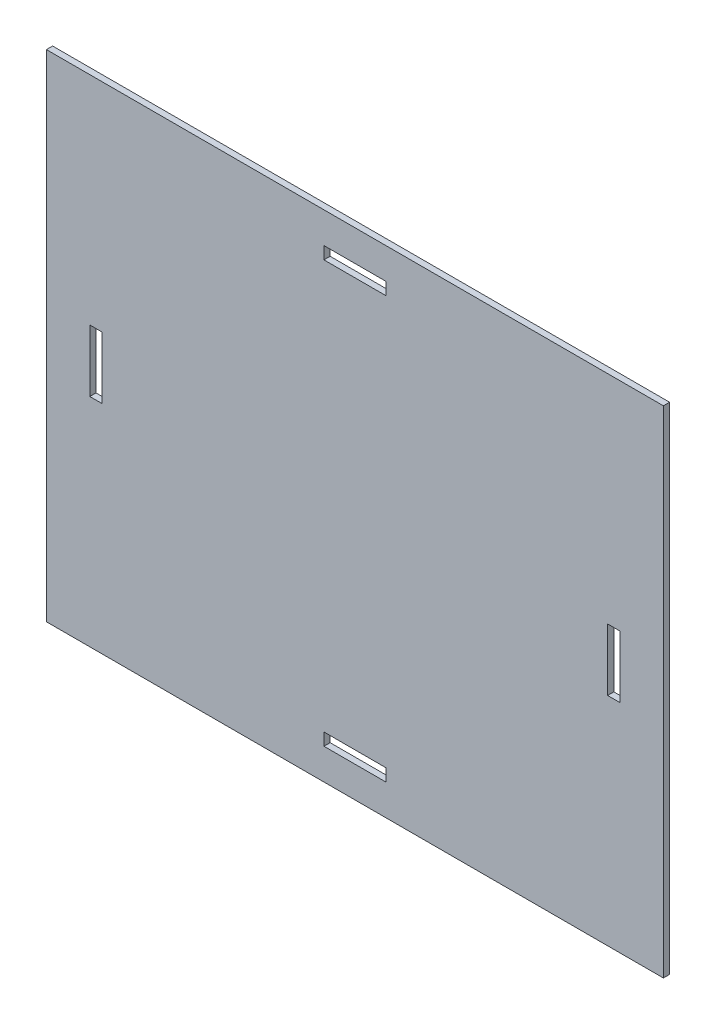
ISO-10303-21;
HEADER;
FILE_DESCRIPTION(('STEP AP214'),'2;1');
FILE_NAME('part.step','',(''),(''),'','','');
FILE_SCHEMA(('AUTOMOTIVE_DESIGN { 1 0 10303 214 1 1 1 1 }'));
ENDSEC;
DATA;
#1=APPLICATION_CONTEXT('core data for automotive mechanical design processes');
#2=APPLICATION_PROTOCOL_DEFINITION('international standard','automotive_design',2000,#1);
#3=PRODUCT_CONTEXT('',#1,'mechanical');
#4=PRODUCT('Part','Part','',(#3));
#5=PRODUCT_RELATED_PRODUCT_CATEGORY('part','',(#4));
#6=PRODUCT_DEFINITION_FORMATION('','',#4);
#7=PRODUCT_DEFINITION_CONTEXT('part definition',#1,'design');
#8=PRODUCT_DEFINITION('design','',#6,#7);
#9=PRODUCT_DEFINITION_SHAPE('','',#8);
#10=(LENGTH_UNIT() NAMED_UNIT(*) SI_UNIT(.MILLI.,.METRE.));
#11=(NAMED_UNIT(*) PLANE_ANGLE_UNIT() SI_UNIT($,.RADIAN.));
#12=(NAMED_UNIT(*) SI_UNIT($,.STERADIAN.) SOLID_ANGLE_UNIT());
#13=UNCERTAINTY_MEASURE_WITH_UNIT(LENGTH_MEASURE(1.E-05),#10,'distance_accuracy_value','');
#14=(GEOMETRIC_REPRESENTATION_CONTEXT(3) GLOBAL_UNCERTAINTY_ASSIGNED_CONTEXT((#13)) GLOBAL_UNIT_ASSIGNED_CONTEXT((#10,
#11,#12)) REPRESENTATION_CONTEXT('',''));
#15=CARTESIAN_POINT('',(0.,0.,0.));
#16=DIRECTION('',(0.,0.,1.));
#17=DIRECTION('',(1.,0.,0.));
#18=AXIS2_PLACEMENT_3D('',#15,#16,#17);
#19=CARTESIAN_POINT('',(-92.4429752066116,75.7768595041322,1.));
#20=DIRECTION('',(1.,0.,0.));
#21=DIRECTION('',(0.,1.,0.));
#22=AXIS2_PLACEMENT_3D('',#19,#20,#21);
#23=PLANE('',#22);
#24=DIRECTION('',(0.,-1.,0.));
#25=VECTOR('',#24,1.);
#26=CARTESIAN_POINT('',(-92.4429752066116,75.7768595041322,0.));
#27=LINE('',#26,#25);
#28=CARTESIAN_POINT('',(-92.4429752066116,75.7768595041322,0.));
#29=VERTEX_POINT('',#28);
#30=CARTESIAN_POINT('',(-92.4429752066116,-4.22314049586777,0.));
#31=VERTEX_POINT('',#30);
#32=EDGE_CURVE('E206',#29,#31,#27,.T.);
#33=ORIENTED_EDGE('',*,*,#32,.T.);
#34=DIRECTION('',(0.,0.,-1.));
#35=VECTOR('',#34,1.);
#36=CARTESIAN_POINT('',(-92.4429752066116,-4.22314049586777,1.));
#37=LINE('',#36,#35);
#38=CARTESIAN_POINT('',(-92.4429752066116,-4.22314049586777,1.));
#39=VERTEX_POINT('',#38);
#40=EDGE_CURVE('E295',#39,#31,#37,.T.);
#41=ORIENTED_EDGE('',*,*,#40,.F.);
#42=DIRECTION('',(0.,-1.,0.));
#43=VECTOR('',#42,1.);
#44=CARTESIAN_POINT('',(-92.4429752066116,75.7768595041322,1.));
#45=LINE('',#44,#43);
#46=CARTESIAN_POINT('',(-92.4429752066116,75.7768595041322,1.));
#47=VERTEX_POINT('',#46);
#48=EDGE_CURVE('E267',#47,#39,#45,.T.);
#49=ORIENTED_EDGE('',*,*,#48,.F.);
#50=DIRECTION('',(0.,0.,-1.));
#51=VECTOR('',#50,1.);
#52=CARTESIAN_POINT('',(-92.4429752066116,75.7768595041322,1.));
#53=LINE('',#52,#51);
#54=EDGE_CURVE('E279',#47,#29,#53,.T.);
#55=ORIENTED_EDGE('',*,*,#54,.T.);
#56=EDGE_LOOP('',(#33,#41,#49,#55));
#57=FACE_BOUND('',#56,.T.);
#58=ADVANCED_FACE('F39',(#57),#23,.F.);
#59=CARTESIAN_POINT('',(-92.4429752066116,-4.22314049586777,1.));
#60=DIRECTION('',(0.,1.,0.));
#61=DIRECTION('',(0.,0.,1.));
#62=AXIS2_PLACEMENT_3D('',#59,#60,#61);
#63=PLANE('',#62);
#64=DIRECTION('',(1.,0.,0.));
#65=VECTOR('',#64,1.);
#66=CARTESIAN_POINT('',(-92.4429752066116,-4.22314049586777,0.));
#67=LINE('',#66,#65);
#68=CARTESIAN_POINT('',(7.15702479338843,-4.22314049586777,0.));
#69=VERTEX_POINT('',#68);
#70=EDGE_CURVE('E282',#31,#69,#67,.T.);
#71=ORIENTED_EDGE('',*,*,#70,.T.);
#72=DIRECTION('',(0.,0.,-1.));
#73=VECTOR('',#72,1.);
#74=CARTESIAN_POINT('',(7.15702479338843,-4.22314049586777,1.));
#75=LINE('',#74,#73);
#76=CARTESIAN_POINT('',(7.15702479338843,-4.22314049586777,1.));
#77=VERTEX_POINT('',#76);
#78=EDGE_CURVE('E293',#77,#69,#75,.T.);
#79=ORIENTED_EDGE('',*,*,#78,.F.);
#80=DIRECTION('',(1.,0.,0.));
#81=VECTOR('',#80,1.);
#82=CARTESIAN_POINT('',(-92.4429752066116,-4.22314049586777,1.));
#83=LINE('',#82,#81);
#84=EDGE_CURVE('E270',#39,#77,#83,.T.);
#85=ORIENTED_EDGE('',*,*,#84,.F.);
#86=ORIENTED_EDGE('',*,*,#40,.T.);
#87=EDGE_LOOP('',(#71,#79,#85,#86));
#88=FACE_BOUND('',#87,.T.);
#89=ADVANCED_FACE('F358',(#88),#63,.F.);
#90=CARTESIAN_POINT('',(7.15702479338842,75.7768595041322,1.));
#91=DIRECTION('',(1.,0.,0.));
#92=DIRECTION('',(0.,1.,0.));
#93=AXIS2_PLACEMENT_3D('',#90,#91,#92);
#94=PLANE('',#93);
#95=DIRECTION('',(0.,-1.,0.));
#96=VECTOR('',#95,1.);
#97=CARTESIAN_POINT('',(7.15702479338842,75.7768595041322,0.));
#98=LINE('',#97,#96);
#99=CARTESIAN_POINT('',(7.15702479338842,75.7768595041322,0.));
#100=VERTEX_POINT('',#99);
#101=EDGE_CURVE('E285',#100,#69,#98,.T.);
#102=ORIENTED_EDGE('',*,*,#101,.F.);
#103=DIRECTION('',(0.,0.,-1.));
#104=VECTOR('',#103,1.);
#105=CARTESIAN_POINT('',(7.15702479338842,75.7768595041322,1.));
#106=LINE('',#105,#104);
#107=CARTESIAN_POINT('',(7.15702479338842,75.7768595041322,1.));
#108=VERTEX_POINT('',#107);
#109=EDGE_CURVE('E291',#108,#100,#106,.T.);
#110=ORIENTED_EDGE('',*,*,#109,.F.);
#111=DIRECTION('',(0.,-1.,0.));
#112=VECTOR('',#111,1.);
#113=CARTESIAN_POINT('',(7.15702479338842,75.7768595041322,1.));
#114=LINE('',#113,#112);
#115=EDGE_CURVE('E273',#108,#77,#114,.T.);
#116=ORIENTED_EDGE('',*,*,#115,.T.);
#117=ORIENTED_EDGE('',*,*,#78,.T.);
#118=EDGE_LOOP('',(#102,#110,#116,#117));
#119=FACE_BOUND('',#118,.T.);
#120=ADVANCED_FACE('F363',(#119),#94,.T.);
#121=CARTESIAN_POINT('',(-92.4429752066116,75.7768595041322,1.));
#122=DIRECTION('',(0.,1.,0.));
#123=DIRECTION('',(0.,0.,1.));
#124=AXIS2_PLACEMENT_3D('',#121,#122,#123);
#125=PLANE('',#124);
#126=DIRECTION('',(1.,0.,0.));
#127=VECTOR('',#126,1.);
#128=CARTESIAN_POINT('',(-92.4429752066116,75.7768595041322,0.));
#129=LINE('',#128,#127);
#130=EDGE_CURVE('E271',#29,#100,#129,.T.);
#131=ORIENTED_EDGE('',*,*,#130,.F.);
#132=ORIENTED_EDGE('',*,*,#54,.F.);
#133=DIRECTION('',(1.,0.,0.));
#134=VECTOR('',#133,1.);
#135=CARTESIAN_POINT('',(-92.4429752066116,75.7768595041322,1.));
#136=LINE('',#135,#134);
#137=EDGE_CURVE('E276',#47,#108,#136,.T.);
#138=ORIENTED_EDGE('',*,*,#137,.T.);
#139=ORIENTED_EDGE('',*,*,#109,.T.);
#140=EDGE_LOOP('',(#131,#132,#138,#139));
#141=FACE_BOUND('',#140,.T.);
#142=ADVANCED_FACE('F371',(#141),#125,.T.);
#143=CARTESIAN_POINT('',(0.,0.,1.));
#144=DIRECTION('',(0.,0.,1.));
#145=DIRECTION('',(1.,0.,0.));
#146=AXIS2_PLACEMENT_3D('',#143,#144,#145);
#147=PLANE('',#146);
#148=DIRECTION('',(0.,1.,0.));
#149=VECTOR('',#148,1.);
#150=CARTESIAN_POINT('',(-37.6429752066116,68.7768595041322,1.));
#151=LINE('',#150,#149);
#152=CARTESIAN_POINT('',(-37.6429752066116,68.7768595041322,1.));
#153=VERTEX_POINT('',#152);
#154=CARTESIAN_POINT('',(-37.6429752066116,70.7768595041322,1.));
#155=VERTEX_POINT('',#154);
#156=EDGE_CURVE('E53',#153,#155,#151,.T.);
#157=ORIENTED_EDGE('',*,*,#156,.F.);
#158=DIRECTION('',(1.,0.,0.));
#159=VECTOR('',#158,1.);
#160=CARTESIAN_POINT('',(-47.6429752066116,68.7768595041322,1.));
#161=LINE('',#160,#159);
#162=CARTESIAN_POINT('',(-47.6429752066116,68.7768595041322,1.));
#163=VERTEX_POINT('',#162);
#164=EDGE_CURVE('E199',#163,#153,#161,.T.);
#165=ORIENTED_EDGE('',*,*,#164,.F.);
#166=DIRECTION('',(0.,-1.,0.));
#167=VECTOR('',#166,1.);
#168=CARTESIAN_POINT('',(-47.6429752066116,68.7768595041322,1.));
#169=LINE('',#168,#167);
#170=CARTESIAN_POINT('',(-47.6429752066116,70.7768595041322,1.));
#171=VERTEX_POINT('',#170);
#172=EDGE_CURVE('E182',#171,#163,#169,.T.);
#173=ORIENTED_EDGE('',*,*,#172,.F.);
#174=DIRECTION('',(-1.,0.,0.));
#175=VECTOR('',#174,1.);
#176=CARTESIAN_POINT('',(-47.6429752066116,70.7768595041322,1.));
#177=LINE('',#176,#175);
#178=EDGE_CURVE('E192',#155,#171,#177,.T.);
#179=ORIENTED_EDGE('',*,*,#178,.F.);
#180=EDGE_LOOP('',(#157,#165,#173,#179));
#181=FACE_BOUND('',#180,.T.);
#182=DIRECTION('',(0.,-1.,0.));
#183=VECTOR('',#182,1.);
#184=CARTESIAN_POINT('',(-47.6429752066116,2.77685950413224,1.));
#185=LINE('',#184,#183);
#186=CARTESIAN_POINT('',(-47.6429752066116,2.77685950413224,1.));
#187=VERTEX_POINT('',#186);
#188=CARTESIAN_POINT('',(-47.6429752066116,0.776859504132241,1.));
#189=VERTEX_POINT('',#188);
#190=EDGE_CURVE('E61',#187,#189,#185,.T.);
#191=ORIENTED_EDGE('',*,*,#190,.F.);
#192=DIRECTION('',(-1.,0.,0.));
#193=VECTOR('',#192,1.);
#194=CARTESIAN_POINT('',(-47.6429752066116,2.77685950413224,1.));
#195=LINE('',#194,#193);
#196=CARTESIAN_POINT('',(-37.6429752066116,2.77685950413224,1.));
#197=VERTEX_POINT('',#196);
#198=EDGE_CURVE('E211',#197,#187,#195,.T.);
#199=ORIENTED_EDGE('',*,*,#198,.F.);
#200=DIRECTION('',(0.,1.,0.));
#201=VECTOR('',#200,1.);
#202=CARTESIAN_POINT('',(-37.6429752066116,2.77685950413224,1.));
#203=LINE('',#202,#201);
#204=CARTESIAN_POINT('',(-37.6429752066116,0.776859504132241,1.));
#205=VERTEX_POINT('',#204);
#206=EDGE_CURVE('E221',#205,#197,#203,.T.);
#207=ORIENTED_EDGE('',*,*,#206,.F.);
#208=DIRECTION('',(1.,0.,0.));
#209=VECTOR('',#208,1.);
#210=CARTESIAN_POINT('',(-47.6429752066116,0.776859504132241,1.));
#211=LINE('',#210,#209);
#212=EDGE_CURVE('E224',#189,#205,#211,.T.);
#213=ORIENTED_EDGE('',*,*,#212,.F.);
#214=EDGE_LOOP('',(#191,#199,#207,#213));
#215=FACE_BOUND('',#214,.T.);
#216=DIRECTION('',(0.,1.,0.));
#217=VECTOR('',#216,1.);
#218=CARTESIAN_POINT('',(-83.4429752066116,30.7768595041322,1.));
#219=LINE('',#218,#217);
#220=CARTESIAN_POINT('',(-83.4429752066116,30.7768595041322,1.));
#221=VERTEX_POINT('',#220);
#222=CARTESIAN_POINT('',(-83.4429752066116,40.7768595041322,1.));
#223=VERTEX_POINT('',#222);
#224=EDGE_CURVE('E218',#221,#223,#219,.T.);
#225=ORIENTED_EDGE('',*,*,#224,.F.);
#226=DIRECTION('',(1.,0.,0.));
#227=VECTOR('',#226,1.);
#228=CARTESIAN_POINT('',(-85.4429752066116,30.7768595041322,1.));
#229=LINE('',#228,#227);
#230=CARTESIAN_POINT('',(-85.4429752066116,30.7768595041322,1.));
#231=VERTEX_POINT('',#230);
#232=EDGE_CURVE('E231',#231,#221,#229,.T.);
#233=ORIENTED_EDGE('',*,*,#232,.F.);
#234=DIRECTION('',(0.,-1.,0.));
#235=VECTOR('',#234,1.);
#236=CARTESIAN_POINT('',(-85.4429752066116,30.7768595041322,1.));
#237=LINE('',#236,#235);
#238=CARTESIAN_POINT('',(-85.4429752066116,40.7768595041322,1.));
#239=VERTEX_POINT('',#238);
#240=EDGE_CURVE('E241',#239,#231,#237,.T.);
#241=ORIENTED_EDGE('',*,*,#240,.F.);
#242=DIRECTION('',(-1.,0.,0.));
#243=VECTOR('',#242,1.);
#244=CARTESIAN_POINT('',(-85.4429752066116,40.7768595041322,1.));
#245=LINE('',#244,#243);
#246=EDGE_CURVE('E244',#223,#239,#245,.T.);
#247=ORIENTED_EDGE('',*,*,#246,.F.);
#248=EDGE_LOOP('',(#225,#233,#241,#247));
#249=FACE_BOUND('',#248,.T.);
#250=DIRECTION('',(-1.,0.,0.));
#251=VECTOR('',#250,1.);
#252=CARTESIAN_POINT('',(0.157024793388444,40.7768595041322,1.));
#253=LINE('',#252,#251);
#254=CARTESIAN_POINT('',(0.157024793388444,40.7768595041322,1.));
#255=VERTEX_POINT('',#254);
#256=CARTESIAN_POINT('',(-1.84297520661156,40.7768595041322,1.));
#257=VERTEX_POINT('',#256);
#258=EDGE_CURVE('E238',#255,#257,#253,.T.);
#259=ORIENTED_EDGE('',*,*,#258,.F.);
#260=DIRECTION('',(0.,1.,0.));
#261=VECTOR('',#260,1.);
#262=CARTESIAN_POINT('',(0.157024793388444,30.7768595041322,1.));
#263=LINE('',#262,#261);
#264=CARTESIAN_POINT('',(0.157024793388444,30.7768595041322,1.));
#265=VERTEX_POINT('',#264);
#266=EDGE_CURVE('E251',#265,#255,#263,.T.);
#267=ORIENTED_EDGE('',*,*,#266,.F.);
#268=DIRECTION('',(1.,0.,0.));
#269=VECTOR('',#268,1.);
#270=CARTESIAN_POINT('',(0.157024793388444,30.7768595041322,1.));
#271=LINE('',#270,#269);
#272=CARTESIAN_POINT('',(-1.84297520661156,30.7768595041322,1.));
#273=VERTEX_POINT('',#272);
#274=EDGE_CURVE('E260',#273,#265,#271,.T.);
#275=ORIENTED_EDGE('',*,*,#274,.F.);
#276=DIRECTION('',(0.,-1.,0.));
#277=VECTOR('',#276,1.);
#278=CARTESIAN_POINT('',(-1.84297520661156,30.7768595041322,1.));
#279=LINE('',#278,#277);
#280=EDGE_CURVE('E263',#257,#273,#279,.T.);
#281=ORIENTED_EDGE('',*,*,#280,.F.);
#282=EDGE_LOOP('',(#259,#267,#275,#281));
#283=FACE_BOUND('',#282,.T.);
#284=ORIENTED_EDGE('',*,*,#48,.T.);
#285=ORIENTED_EDGE('',*,*,#84,.T.);
#286=ORIENTED_EDGE('',*,*,#115,.F.);
#287=ORIENTED_EDGE('',*,*,#137,.F.);
#288=EDGE_LOOP('',(#284,#285,#286,#287));
#289=FACE_BOUND('',#288,.T.);
#290=ADVANCED_FACE('F196',(#181,#215,#249,#283,#289),#147,.T.);
#291=CARTESIAN_POINT('',(0.,0.,0.));
#292=DIRECTION('',(0.,0.,1.));
#293=DIRECTION('',(1.,0.,0.));
#294=AXIS2_PLACEMENT_3D('',#291,#292,#293);
#295=PLANE('',#294);
#296=DIRECTION('',(1.,0.,0.));
#297=VECTOR('',#296,1.);
#298=CARTESIAN_POINT('',(0.,68.7768595041322,0.));
#299=LINE('',#298,#297);
#300=CARTESIAN_POINT('',(-47.6429752066116,68.7768595041322,0.));
#301=VERTEX_POINT('',#300);
#302=CARTESIAN_POINT('',(-37.6429752066116,68.7768595041322,0.));
#303=VERTEX_POINT('',#302);
#304=EDGE_CURVE('E46',#301,#303,#299,.T.);
#305=ORIENTED_EDGE('',*,*,#304,.T.);
#306=DIRECTION('',(0.,1.,0.));
#307=VECTOR('',#306,1.);
#308=CARTESIAN_POINT('',(-37.6429752066116,0.,0.));
#309=LINE('',#308,#307);
#310=CARTESIAN_POINT('',(-37.6429752066116,70.7768595041322,0.));
#311=VERTEX_POINT('',#310);
#312=EDGE_CURVE('E11',#303,#311,#309,.T.);
#313=ORIENTED_EDGE('',*,*,#312,.T.);
#314=DIRECTION('',(-1.,0.,0.));
#315=VECTOR('',#314,1.);
#316=CARTESIAN_POINT('',(0.,70.7768595041322,0.));
#317=LINE('',#316,#315);
#318=CARTESIAN_POINT('',(-47.6429752066116,70.7768595041322,0.));
#319=VERTEX_POINT('',#318);
#320=EDGE_CURVE('E334',#311,#319,#317,.T.);
#321=ORIENTED_EDGE('',*,*,#320,.T.);
#322=DIRECTION('',(0.,-1.,0.));
#323=VECTOR('',#322,1.);
#324=CARTESIAN_POINT('',(-47.6429752066116,0.,0.));
#325=LINE('',#324,#323);
#326=EDGE_CURVE('E185',#319,#301,#325,.T.);
#327=ORIENTED_EDGE('',*,*,#326,.T.);
#328=EDGE_LOOP('',(#305,#313,#321,#327));
#329=FACE_BOUND('',#328,.T.);
#330=DIRECTION('',(-1.,0.,0.));
#331=VECTOR('',#330,1.);
#332=CARTESIAN_POINT('',(0.,2.77685950413224,0.));
#333=LINE('',#332,#331);
#334=CARTESIAN_POINT('',(-37.6429752066116,2.77685950413224,0.));
#335=VERTEX_POINT('',#334);
#336=CARTESIAN_POINT('',(-47.6429752066116,2.77685950413224,0.));
#337=VERTEX_POINT('',#336);
#338=EDGE_CURVE('E328',#335,#337,#333,.T.);
#339=ORIENTED_EDGE('',*,*,#338,.T.);
#340=DIRECTION('',(0.,-1.,0.));
#341=VECTOR('',#340,1.);
#342=CARTESIAN_POINT('',(-47.6429752066116,0.,0.));
#343=LINE('',#342,#341);
#344=CARTESIAN_POINT('',(-47.6429752066116,0.776859504132241,0.));
#345=VERTEX_POINT('',#344);
#346=EDGE_CURVE('E331',#337,#345,#343,.T.);
#347=ORIENTED_EDGE('',*,*,#346,.T.);
#348=DIRECTION('',(1.,0.,0.));
#349=VECTOR('',#348,1.);
#350=CARTESIAN_POINT('',(0.,0.776859504132241,0.));
#351=LINE('',#350,#349);
#352=CARTESIAN_POINT('',(-37.6429752066116,0.776859504132241,0.));
#353=VERTEX_POINT('',#352);
#354=EDGE_CURVE('E322',#345,#353,#351,.T.);
#355=ORIENTED_EDGE('',*,*,#354,.T.);
#356=DIRECTION('',(0.,1.,0.));
#357=VECTOR('',#356,1.);
#358=CARTESIAN_POINT('',(-37.6429752066116,0.,0.));
#359=LINE('',#358,#357);
#360=EDGE_CURVE('E325',#353,#335,#359,.T.);
#361=ORIENTED_EDGE('',*,*,#360,.T.);
#362=EDGE_LOOP('',(#339,#347,#355,#361));
#363=FACE_BOUND('',#362,.T.);
#364=DIRECTION('',(1.,0.,0.));
#365=VECTOR('',#364,1.);
#366=CARTESIAN_POINT('',(0.,30.7768595041322,0.));
#367=LINE('',#366,#365);
#368=CARTESIAN_POINT('',(-85.4429752066116,30.7768595041322,0.));
#369=VERTEX_POINT('',#368);
#370=CARTESIAN_POINT('',(-83.4429752066116,30.7768595041322,0.));
#371=VERTEX_POINT('',#370);
#372=EDGE_CURVE('E316',#369,#371,#367,.T.);
#373=ORIENTED_EDGE('',*,*,#372,.T.);
#374=DIRECTION('',(0.,1.,0.));
#375=VECTOR('',#374,1.);
#376=CARTESIAN_POINT('',(-83.4429752066116,0.,0.));
#377=LINE('',#376,#375);
#378=CARTESIAN_POINT('',(-83.4429752066116,40.7768595041322,0.));
#379=VERTEX_POINT('',#378);
#380=EDGE_CURVE('E319',#371,#379,#377,.T.);
#381=ORIENTED_EDGE('',*,*,#380,.T.);
#382=DIRECTION('',(-1.,0.,0.));
#383=VECTOR('',#382,1.);
#384=CARTESIAN_POINT('',(0.,40.7768595041322,0.));
#385=LINE('',#384,#383);
#386=CARTESIAN_POINT('',(-85.4429752066116,40.7768595041322,0.));
#387=VERTEX_POINT('',#386);
#388=EDGE_CURVE('E310',#379,#387,#385,.T.);
#389=ORIENTED_EDGE('',*,*,#388,.T.);
#390=DIRECTION('',(0.,-1.,0.));
#391=VECTOR('',#390,1.);
#392=CARTESIAN_POINT('',(-85.4429752066116,0.,0.));
#393=LINE('',#392,#391);
#394=EDGE_CURVE('E313',#387,#369,#393,.T.);
#395=ORIENTED_EDGE('',*,*,#394,.T.);
#396=EDGE_LOOP('',(#373,#381,#389,#395));
#397=FACE_BOUND('',#396,.T.);
#398=DIRECTION('',(0.,1.,0.));
#399=VECTOR('',#398,1.);
#400=CARTESIAN_POINT('',(0.157024793388444,0.,0.));
#401=LINE('',#400,#399);
#402=CARTESIAN_POINT('',(0.157024793388444,30.7768595041322,0.));
#403=VERTEX_POINT('',#402);
#404=CARTESIAN_POINT('',(0.157024793388444,40.7768595041322,0.));
#405=VERTEX_POINT('',#404);
#406=EDGE_CURVE('E304',#403,#405,#401,.T.);
#407=ORIENTED_EDGE('',*,*,#406,.T.);
#408=DIRECTION('',(-1.,0.,0.));
#409=VECTOR('',#408,1.);
#410=CARTESIAN_POINT('',(-1.41473150916852E-13,40.7768595041322,0.));
#411=LINE('',#410,#409);
#412=CARTESIAN_POINT('',(-1.84297520661156,40.7768595041322,0.));
#413=VERTEX_POINT('',#412);
#414=EDGE_CURVE('E307',#405,#413,#411,.T.);
#415=ORIENTED_EDGE('',*,*,#414,.T.);
#416=DIRECTION('',(0.,-1.,0.));
#417=VECTOR('',#416,1.);
#418=CARTESIAN_POINT('',(-1.84297520661156,0.,0.));
#419=LINE('',#418,#417);
#420=CARTESIAN_POINT('',(-1.84297520661156,30.7768595041322,0.));
#421=VERTEX_POINT('',#420);
#422=EDGE_CURVE('E298',#413,#421,#419,.T.);
#423=ORIENTED_EDGE('',*,*,#422,.T.);
#424=DIRECTION('',(1.,0.,0.));
#425=VECTOR('',#424,1.);
#426=CARTESIAN_POINT('',(0.,30.7768595041322,0.));
#427=LINE('',#426,#425);
#428=EDGE_CURVE('E301',#421,#403,#427,.T.);
#429=ORIENTED_EDGE('',*,*,#428,.T.);
#430=EDGE_LOOP('',(#407,#415,#423,#429));
#431=FACE_BOUND('',#430,.T.);
#432=ORIENTED_EDGE('',*,*,#32,.F.);
#433=ORIENTED_EDGE('',*,*,#130,.T.);
#434=ORIENTED_EDGE('',*,*,#101,.T.);
#435=ORIENTED_EDGE('',*,*,#70,.F.);
#436=EDGE_LOOP('',(#432,#433,#434,#435));
#437=FACE_BOUND('',#436,.T.);
#438=ADVANCED_FACE('F338',(#329,#363,#397,#431,#437),#295,.F.);
#439=CARTESIAN_POINT('',(0.157024793388444,40.7768595041322,-9.));
#440=DIRECTION('',(0.,1.,0.));
#441=DIRECTION('',(-1.,0.,0.));
#442=AXIS2_PLACEMENT_3D('',#439,#440,#441);
#443=PLANE('',#442);
#444=DIRECTION('',(0.,0.,1.));
#445=VECTOR('',#444,1.);
#446=CARTESIAN_POINT('',(0.157024793388444,40.7768595041322,-9.));
#447=LINE('',#446,#445);
#448=EDGE_CURVE('E256',#405,#255,#447,.T.);
#449=ORIENTED_EDGE('',*,*,#448,.T.);
#450=ORIENTED_EDGE('',*,*,#258,.T.);
#451=DIRECTION('',(0.,0.,1.));
#452=VECTOR('',#451,1.);
#453=CARTESIAN_POINT('',(-1.84297520661156,40.7768595041322,-9.));
#454=LINE('',#453,#452);
#455=EDGE_CURVE('E248',#413,#257,#454,.T.);
#456=ORIENTED_EDGE('',*,*,#455,.F.);
#457=ORIENTED_EDGE('',*,*,#414,.F.);
#458=EDGE_LOOP('',(#449,#450,#456,#457));
#459=FACE_BOUND('',#458,.T.);
#460=ADVANCED_FACE('F384',(#459),#443,.F.);
#461=CARTESIAN_POINT('',(0.157024793388444,30.7768595041322,-9.));
#462=DIRECTION('',(1.,0.,0.));
#463=DIRECTION('',(0.,0.,-1.));
#464=AXIS2_PLACEMENT_3D('',#461,#462,#463);
#465=PLANE('',#464);
#466=DIRECTION('',(0.,0.,1.));
#467=VECTOR('',#466,1.);
#468=CARTESIAN_POINT('',(0.157024793388444,30.7768595041322,-9.));
#469=LINE('',#468,#467);
#470=EDGE_CURVE('E254',#403,#265,#469,.T.);
#471=ORIENTED_EDGE('',*,*,#470,.T.);
#472=ORIENTED_EDGE('',*,*,#266,.T.);
#473=ORIENTED_EDGE('',*,*,#448,.F.);
#474=ORIENTED_EDGE('',*,*,#406,.F.);
#475=EDGE_LOOP('',(#471,#472,#473,#474));
#476=FACE_BOUND('',#475,.T.);
#477=ADVANCED_FACE('F389',(#476),#465,.F.);
#478=CARTESIAN_POINT('',(0.157024793388444,30.7768595041322,-9.));
#479=DIRECTION('',(0.,-1.,0.));
#480=DIRECTION('',(0.,0.,-1.));
#481=AXIS2_PLACEMENT_3D('',#478,#479,#480);
#482=PLANE('',#481);
#483=DIRECTION('',(0.,0.,1.));
#484=VECTOR('',#483,1.);
#485=CARTESIAN_POINT('',(-1.84297520661156,30.7768595041322,-9.));
#486=LINE('',#485,#484);
#487=EDGE_CURVE('E252',#421,#273,#486,.T.);
#488=ORIENTED_EDGE('',*,*,#487,.T.);
#489=ORIENTED_EDGE('',*,*,#274,.T.);
#490=ORIENTED_EDGE('',*,*,#470,.F.);
#491=ORIENTED_EDGE('',*,*,#428,.F.);
#492=EDGE_LOOP('',(#488,#489,#490,#491));
#493=FACE_BOUND('',#492,.T.);
#494=ADVANCED_FACE('F425',(#493),#482,.F.);
#495=CARTESIAN_POINT('',(-1.84297520661156,30.7768595041322,-9.));
#496=DIRECTION('',(-1.,0.,0.));
#497=DIRECTION('',(0.,0.,1.));
#498=AXIS2_PLACEMENT_3D('',#495,#496,#497);
#499=PLANE('',#498);
#500=ORIENTED_EDGE('',*,*,#455,.T.);
#501=ORIENTED_EDGE('',*,*,#280,.T.);
#502=ORIENTED_EDGE('',*,*,#487,.F.);
#503=ORIENTED_EDGE('',*,*,#422,.F.);
#504=EDGE_LOOP('',(#500,#501,#502,#503));
#505=FACE_BOUND('',#504,.T.);
#506=ADVANCED_FACE('F432',(#505),#499,.F.);
#507=CARTESIAN_POINT('',(-83.4429752066116,30.7768595041322,-9.));
#508=DIRECTION('',(1.,0.,0.));
#509=DIRECTION('',(0.,0.,-1.));
#510=AXIS2_PLACEMENT_3D('',#507,#508,#509);
#511=PLANE('',#510);
#512=DIRECTION('',(0.,0.,1.));
#513=VECTOR('',#512,1.);
#514=CARTESIAN_POINT('',(-83.4429752066116,30.7768595041322,-9.));
#515=LINE('',#514,#513);
#516=EDGE_CURVE('E236',#371,#221,#515,.T.);
#517=ORIENTED_EDGE('',*,*,#516,.T.);
#518=ORIENTED_EDGE('',*,*,#224,.T.);
#519=DIRECTION('',(0.,0.,1.));
#520=VECTOR('',#519,1.);
#521=CARTESIAN_POINT('',(-83.4429752066116,40.7768595041322,-9.));
#522=LINE('',#521,#520);
#523=EDGE_CURVE('E228',#379,#223,#522,.T.);
#524=ORIENTED_EDGE('',*,*,#523,.F.);
#525=ORIENTED_EDGE('',*,*,#380,.F.);
#526=EDGE_LOOP('',(#517,#518,#524,#525));
#527=FACE_BOUND('',#526,.T.);
#528=ADVANCED_FACE('F439',(#527),#511,.F.);
#529=CARTESIAN_POINT('',(-85.4429752066116,30.7768595041322,-9.));
#530=DIRECTION('',(0.,-1.,0.));
#531=DIRECTION('',(0.,0.,-1.));
#532=AXIS2_PLACEMENT_3D('',#529,#530,#531);
#533=PLANE('',#532);
#534=DIRECTION('',(0.,0.,1.));
#535=VECTOR('',#534,1.);
#536=CARTESIAN_POINT('',(-85.4429752066116,30.7768595041322,-9.));
#537=LINE('',#536,#535);
#538=EDGE_CURVE('E234',#369,#231,#537,.T.);
#539=ORIENTED_EDGE('',*,*,#538,.T.);
#540=ORIENTED_EDGE('',*,*,#232,.T.);
#541=ORIENTED_EDGE('',*,*,#516,.F.);
#542=ORIENTED_EDGE('',*,*,#372,.F.);
#543=EDGE_LOOP('',(#539,#540,#541,#542));
#544=FACE_BOUND('',#543,.T.);
#545=ADVANCED_FACE('F447',(#544),#533,.F.);
#546=CARTESIAN_POINT('',(-85.4429752066116,30.7768595041322,-9.));
#547=DIRECTION('',(-1.,0.,0.));
#548=DIRECTION('',(0.,0.,1.));
#549=AXIS2_PLACEMENT_3D('',#546,#547,#548);
#550=PLANE('',#549);
#551=DIRECTION('',(0.,0.,1.));
#552=VECTOR('',#551,1.);
#553=CARTESIAN_POINT('',(-85.4429752066116,40.7768595041322,-9.));
#554=LINE('',#553,#552);
#555=EDGE_CURVE('E232',#387,#239,#554,.T.);
#556=ORIENTED_EDGE('',*,*,#555,.T.);
#557=ORIENTED_EDGE('',*,*,#240,.T.);
#558=ORIENTED_EDGE('',*,*,#538,.F.);
#559=ORIENTED_EDGE('',*,*,#394,.F.);
#560=EDGE_LOOP('',(#556,#557,#558,#559));
#561=FACE_BOUND('',#560,.T.);
#562=ADVANCED_FACE('F455',(#561),#550,.F.);
#563=CARTESIAN_POINT('',(-85.4429752066116,40.7768595041322,-9.));
#564=DIRECTION('',(0.,1.,0.));
#565=DIRECTION('',(0.,0.,1.));
#566=AXIS2_PLACEMENT_3D('',#563,#564,#565);
#567=PLANE('',#566);
#568=ORIENTED_EDGE('',*,*,#523,.T.);
#569=ORIENTED_EDGE('',*,*,#246,.T.);
#570=ORIENTED_EDGE('',*,*,#555,.F.);
#571=ORIENTED_EDGE('',*,*,#388,.F.);
#572=EDGE_LOOP('',(#568,#569,#570,#571));
#573=FACE_BOUND('',#572,.T.);
#574=ADVANCED_FACE('F463',(#573),#567,.F.);
#575=CARTESIAN_POINT('',(-47.6429752066116,2.77685950413224,-9.));
#576=DIRECTION('',(-1.,0.,0.));
#577=DIRECTION('',(0.,0.,1.));
#578=AXIS2_PLACEMENT_3D('',#575,#576,#577);
#579=PLANE('',#578);
#580=DIRECTION('',(0.,0.,1.));
#581=VECTOR('',#580,1.);
#582=CARTESIAN_POINT('',(-47.6429752066116,2.77685950413224,-9.));
#583=LINE('',#582,#581);
#584=EDGE_CURVE('E216',#337,#187,#583,.T.);
#585=ORIENTED_EDGE('',*,*,#584,.T.);
#586=ORIENTED_EDGE('',*,*,#190,.T.);
#587=DIRECTION('',(0.,0.,1.));
#588=VECTOR('',#587,1.);
#589=CARTESIAN_POINT('',(-47.6429752066116,0.776859504132241,-9.));
#590=LINE('',#589,#588);
#591=EDGE_CURVE('E209',#345,#189,#590,.T.);
#592=ORIENTED_EDGE('',*,*,#591,.F.);
#593=ORIENTED_EDGE('',*,*,#346,.F.);
#594=EDGE_LOOP('',(#585,#586,#592,#593));
#595=FACE_BOUND('',#594,.T.);
#596=ADVANCED_FACE('F471',(#595),#579,.F.);
#597=CARTESIAN_POINT('',(-47.6429752066116,2.77685950413224,-9.));
#598=DIRECTION('',(0.,1.,0.));
#599=DIRECTION('',(0.,0.,1.));
#600=AXIS2_PLACEMENT_3D('',#597,#598,#599);
#601=PLANE('',#600);
#602=DIRECTION('',(0.,0.,1.));
#603=VECTOR('',#602,1.);
#604=CARTESIAN_POINT('',(-37.6429752066116,2.77685950413224,-9.));
#605=LINE('',#604,#603);
#606=EDGE_CURVE('E214',#335,#197,#605,.T.);
#607=ORIENTED_EDGE('',*,*,#606,.T.);
#608=ORIENTED_EDGE('',*,*,#198,.T.);
#609=ORIENTED_EDGE('',*,*,#584,.F.);
#610=ORIENTED_EDGE('',*,*,#338,.F.);
#611=EDGE_LOOP('',(#607,#608,#609,#610));
#612=FACE_BOUND('',#611,.T.);
#613=ADVANCED_FACE('F479',(#612),#601,.F.);
#614=CARTESIAN_POINT('',(-37.6429752066116,2.77685950413224,-9.));
#615=DIRECTION('',(1.,0.,0.));
#616=DIRECTION('',(0.,0.,-1.));
#617=AXIS2_PLACEMENT_3D('',#614,#615,#616);
#618=PLANE('',#617);
#619=DIRECTION('',(0.,0.,1.));
#620=VECTOR('',#619,1.);
#621=CARTESIAN_POINT('',(-37.6429752066116,0.776859504132241,-9.));
#622=LINE('',#621,#620);
#623=EDGE_CURVE('E212',#353,#205,#622,.T.);
#624=ORIENTED_EDGE('',*,*,#623,.T.);
#625=ORIENTED_EDGE('',*,*,#206,.T.);
#626=ORIENTED_EDGE('',*,*,#606,.F.);
#627=ORIENTED_EDGE('',*,*,#360,.F.);
#628=EDGE_LOOP('',(#624,#625,#626,#627));
#629=FACE_BOUND('',#628,.T.);
#630=ADVANCED_FACE('F352',(#629),#618,.F.);
#631=CARTESIAN_POINT('',(-47.6429752066116,0.776859504132241,-9.));
#632=DIRECTION('',(0.,-1.,0.));
#633=DIRECTION('',(0.,0.,-1.));
#634=AXIS2_PLACEMENT_3D('',#631,#632,#633);
#635=PLANE('',#634);
#636=ORIENTED_EDGE('',*,*,#591,.T.);
#637=ORIENTED_EDGE('',*,*,#212,.T.);
#638=ORIENTED_EDGE('',*,*,#623,.F.);
#639=ORIENTED_EDGE('',*,*,#354,.F.);
#640=EDGE_LOOP('',(#636,#637,#638,#639));
#641=FACE_BOUND('',#640,.T.);
#642=ADVANCED_FACE('F345',(#641),#635,.F.);
#643=CARTESIAN_POINT('',(-37.6429752066116,68.7768595041322,-9.));
#644=DIRECTION('',(1.,0.,0.));
#645=DIRECTION('',(0.,0.,-1.));
#646=AXIS2_PLACEMENT_3D('',#643,#644,#645);
#647=PLANE('',#646);
#648=DIRECTION('',(0.,0.,1.));
#649=VECTOR('',#648,1.);
#650=CARTESIAN_POINT('',(-37.6429752066116,68.7768595041322,-9.));
#651=LINE('',#650,#649);
#652=EDGE_CURVE('E204',#303,#153,#651,.T.);
#653=ORIENTED_EDGE('',*,*,#652,.T.);
#654=ORIENTED_EDGE('',*,*,#156,.T.);
#655=DIRECTION('',(0.,0.,1.));
#656=VECTOR('',#655,1.);
#657=CARTESIAN_POINT('',(-37.6429752066116,70.7768595041322,-9.));
#658=LINE('',#657,#656);
#659=EDGE_CURVE('E189',#311,#155,#658,.T.);
#660=ORIENTED_EDGE('',*,*,#659,.F.);
#661=ORIENTED_EDGE('',*,*,#312,.F.);
#662=EDGE_LOOP('',(#653,#654,#660,#661));
#663=FACE_BOUND('',#662,.T.);
#664=ADVANCED_FACE('F343',(#663),#647,.F.);
#665=CARTESIAN_POINT('',(-47.6429752066116,68.7768595041322,-9.));
#666=DIRECTION('',(0.,-1.,0.));
#667=DIRECTION('',(0.,0.,-1.));
#668=AXIS2_PLACEMENT_3D('',#665,#666,#667);
#669=PLANE('',#668);
#670=DIRECTION('',(0.,0.,1.));
#671=VECTOR('',#670,1.);
#672=CARTESIAN_POINT('',(-47.6429752066116,68.7768595041322,-9.));
#673=LINE('',#672,#671);
#674=EDGE_CURVE('E188',#301,#163,#673,.T.);
#675=ORIENTED_EDGE('',*,*,#674,.T.);
#676=ORIENTED_EDGE('',*,*,#164,.T.);
#677=ORIENTED_EDGE('',*,*,#652,.F.);
#678=ORIENTED_EDGE('',*,*,#304,.F.);
#679=EDGE_LOOP('',(#675,#676,#677,#678));
#680=FACE_BOUND('',#679,.T.);
#681=ADVANCED_FACE('F342',(#680),#669,.F.);
#682=CARTESIAN_POINT('',(-47.6429752066116,68.7768595041322,-9.));
#683=DIRECTION('',(-1.,0.,0.));
#684=DIRECTION('',(0.,0.,1.));
#685=AXIS2_PLACEMENT_3D('',#682,#683,#684);
#686=PLANE('',#685);
#687=DIRECTION('',(0.,0.,1.));
#688=VECTOR('',#687,1.);
#689=CARTESIAN_POINT('',(-47.6429752066116,70.7768595041322,-9.));
#690=LINE('',#689,#688);
#691=EDGE_CURVE('E177',#319,#171,#690,.T.);
#692=ORIENTED_EDGE('',*,*,#691,.T.);
#693=ORIENTED_EDGE('',*,*,#172,.T.);
#694=ORIENTED_EDGE('',*,*,#674,.F.);
#695=ORIENTED_EDGE('',*,*,#326,.F.);
#696=EDGE_LOOP('',(#692,#693,#694,#695));
#697=FACE_BOUND('',#696,.T.);
#698=ADVANCED_FACE('F179',(#697),#686,.F.);
#699=CARTESIAN_POINT('',(-47.6429752066116,70.7768595041322,-9.));
#700=DIRECTION('',(0.,1.,0.));
#701=DIRECTION('',(0.,0.,1.));
#702=AXIS2_PLACEMENT_3D('',#699,#700,#701);
#703=PLANE('',#702);
#704=ORIENTED_EDGE('',*,*,#659,.T.);
#705=ORIENTED_EDGE('',*,*,#178,.T.);
#706=ORIENTED_EDGE('',*,*,#691,.F.);
#707=ORIENTED_EDGE('',*,*,#320,.F.);
#708=EDGE_LOOP('',(#704,#705,#706,#707));
#709=FACE_BOUND('',#708,.T.);
#710=ADVANCED_FACE('F193',(#709),#703,.F.);
#711=CLOSED_SHELL('',(#58,#89,#120,#142,#290,#438,#460,#477,#494,#506,#528,#545,#562,#574,#596,
#613,#630,#642,#664,#681,#698,#710));
#712=MANIFOLD_SOLID_BREP('B2',#711);
#713=ADVANCED_BREP_SHAPE_REPRESENTATION('',(#18,#712),#14);
#714=SHAPE_DEFINITION_REPRESENTATION(#9,#713);
ENDSEC;
END-ISO-10303-21;
